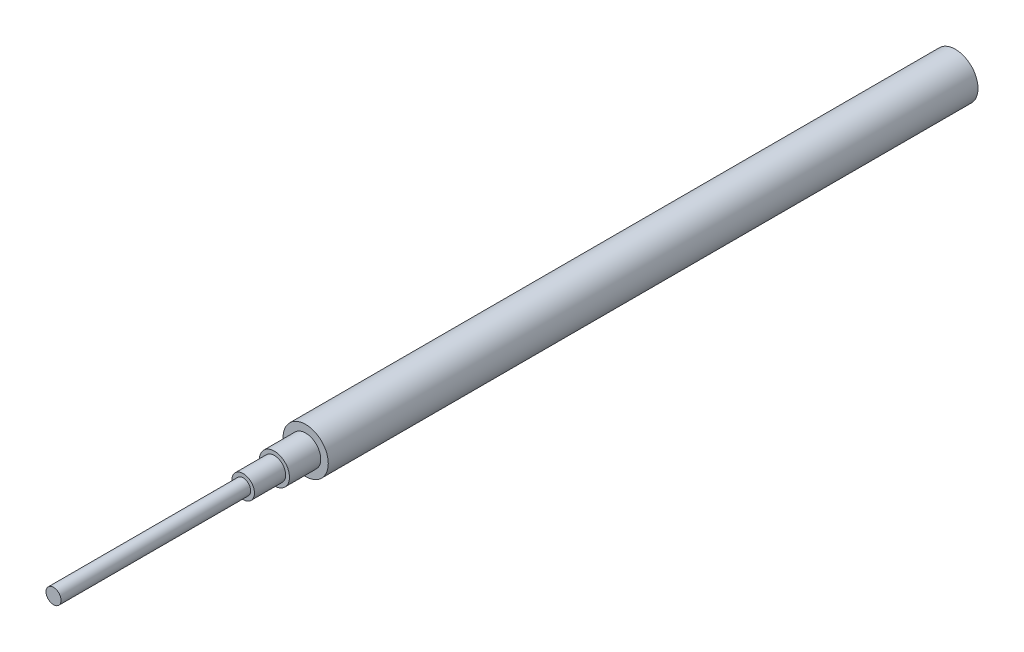
ISO-10303-21;
HEADER;
FILE_DESCRIPTION(('STEP AP214'),'2;1');
FILE_NAME('part.step','',(''),(''),'','','');
FILE_SCHEMA(('AUTOMOTIVE_DESIGN { 1 0 10303 214 1 1 1 1 }'));
ENDSEC;
DATA;
#1=APPLICATION_CONTEXT('core data for automotive mechanical design processes');
#2=APPLICATION_PROTOCOL_DEFINITION('international standard','automotive_design',2000,#1);
#3=PRODUCT_CONTEXT('',#1,'mechanical');
#4=PRODUCT('Part','Part','',(#3));
#5=PRODUCT_RELATED_PRODUCT_CATEGORY('part','',(#4));
#6=PRODUCT_DEFINITION_FORMATION('','',#4);
#7=PRODUCT_DEFINITION_CONTEXT('part definition',#1,'design');
#8=PRODUCT_DEFINITION('design','',#6,#7);
#9=PRODUCT_DEFINITION_SHAPE('','',#8);
#10=(LENGTH_UNIT() NAMED_UNIT(*) SI_UNIT(.MILLI.,.METRE.));
#11=(NAMED_UNIT(*) PLANE_ANGLE_UNIT() SI_UNIT($,.RADIAN.));
#12=(NAMED_UNIT(*) SI_UNIT($,.STERADIAN.) SOLID_ANGLE_UNIT());
#13=UNCERTAINTY_MEASURE_WITH_UNIT(LENGTH_MEASURE(1.E-05),#10,'distance_accuracy_value','');
#14=(GEOMETRIC_REPRESENTATION_CONTEXT(3) GLOBAL_UNCERTAINTY_ASSIGNED_CONTEXT((#13)) GLOBAL_UNIT_ASSIGNED_CONTEXT((#10,
#11,#12)) REPRESENTATION_CONTEXT('',''));
#15=CARTESIAN_POINT('',(0.,0.,0.));
#16=DIRECTION('',(0.,0.,1.));
#17=DIRECTION('',(1.,0.,0.));
#18=AXIS2_PLACEMENT_3D('',#15,#16,#17);
#19=CARTESIAN_POINT('',(0.,0.,136.88));
#20=DIRECTION('',(0.,0.,-1.));
#21=DIRECTION('',(-1.,0.,0.));
#22=AXIS2_PLACEMENT_3D('',#19,#20,#21);
#23=CYLINDRICAL_SURFACE('',#22,4.7625);
#24=CARTESIAN_POINT('',(0.,0.,136.88));
#25=DIRECTION('',(0.,0.,1.));
#26=DIRECTION('',(1.,0.,0.));
#27=AXIS2_PLACEMENT_3D('',#24,#25,#26);
#28=CIRCLE('',#27,4.7625);
#29=CARTESIAN_POINT('',(4.7625,0.,136.88));
#30=VERTEX_POINT('',#29);
#31=EDGE_CURVE('E10',#30,#30,#28,.T.);
#32=ORIENTED_EDGE('',*,*,#31,.F.);
#33=EDGE_LOOP('',(#32));
#34=FACE_BOUND('',#33,.T.);
#35=CARTESIAN_POINT('',(0.,0.,0.));
#36=DIRECTION('',(0.,0.,1.));
#37=DIRECTION('',(1.,0.,0.));
#38=AXIS2_PLACEMENT_3D('',#35,#36,#37);
#39=CIRCLE('',#38,4.7625);
#40=CARTESIAN_POINT('',(4.7625,0.,0.));
#41=VERTEX_POINT('',#40);
#42=EDGE_CURVE('E46',#41,#41,#39,.T.);
#43=ORIENTED_EDGE('',*,*,#42,.T.);
#44=EDGE_LOOP('',(#43));
#45=FACE_BOUND('',#44,.T.);
#46=ADVANCED_FACE('F39',(#34,#45),#23,.T.);
#47=CARTESIAN_POINT('',(0.,0.,136.88));
#48=DIRECTION('',(0.,0.,1.));
#49=DIRECTION('',(1.,0.,0.));
#50=AXIS2_PLACEMENT_3D('',#47,#48,#49);
#51=PLANE('',#50);
#52=CARTESIAN_POINT('',(0.,0.,136.88));
#53=DIRECTION('',(0.,0.,1.));
#54=DIRECTION('',(1.,0.,0.));
#55=AXIS2_PLACEMENT_3D('',#52,#53,#54);
#56=CIRCLE('',#55,3.175);
#57=CARTESIAN_POINT('',(3.175,0.,136.88));
#58=VERTEX_POINT('',#57);
#59=EDGE_CURVE('E51',#58,#58,#56,.F.);
#60=ORIENTED_EDGE('',*,*,#59,.T.);
#61=EDGE_LOOP('',(#60));
#62=FACE_BOUND('',#61,.T.);
#63=ORIENTED_EDGE('',*,*,#31,.T.);
#64=EDGE_LOOP('',(#63));
#65=FACE_BOUND('',#64,.T.);
#66=ADVANCED_FACE('F90',(#62,#65),#51,.T.);
#67=CARTESIAN_POINT('',(0.,0.,0.));
#68=DIRECTION('',(0.,0.,1.));
#69=DIRECTION('',(1.,0.,0.));
#70=AXIS2_PLACEMENT_3D('',#67,#68,#69);
#71=PLANE('',#70);
#72=ORIENTED_EDGE('',*,*,#42,.F.);
#73=EDGE_LOOP('',(#72));
#74=FACE_BOUND('',#73,.T.);
#75=ADVANCED_FACE('F94',(#74),#71,.F.);
#76=CARTESIAN_POINT('',(0.,0.,143.47));
#77=DIRECTION('',(0.,0.,-1.));
#78=DIRECTION('',(-1.,0.,0.));
#79=AXIS2_PLACEMENT_3D('',#76,#77,#78);
#80=CYLINDRICAL_SURFACE('',#79,3.175);
#81=ORIENTED_EDGE('',*,*,#59,.F.);
#82=EDGE_LOOP('',(#81));
#83=FACE_BOUND('',#82,.T.);
#84=CARTESIAN_POINT('',(0.,0.,143.47));
#85=DIRECTION('',(0.,0.,1.));
#86=DIRECTION('',(1.,0.,0.));
#87=AXIS2_PLACEMENT_3D('',#84,#85,#86);
#88=CIRCLE('',#87,3.175);
#89=CARTESIAN_POINT('',(3.175,0.,143.47));
#90=VERTEX_POINT('',#89);
#91=EDGE_CURVE('E60',#90,#90,#88,.T.);
#92=ORIENTED_EDGE('',*,*,#91,.F.);
#93=EDGE_LOOP('',(#92));
#94=FACE_BOUND('',#93,.T.);
#95=ADVANCED_FACE('F101',(#83,#94),#80,.T.);
#96=CARTESIAN_POINT('',(0.,0.,143.47));
#97=DIRECTION('',(0.,0.,1.));
#98=DIRECTION('',(1.,0.,0.));
#99=AXIS2_PLACEMENT_3D('',#96,#97,#98);
#100=PLANE('',#99);
#101=CARTESIAN_POINT('',(0.,0.,143.47));
#102=DIRECTION('',(0.,0.,1.));
#103=DIRECTION('',(1.,0.,0.));
#104=AXIS2_PLACEMENT_3D('',#101,#102,#103);
#105=CIRCLE('',#104,2.38125);
#106=CARTESIAN_POINT('',(2.38125,0.,143.47));
#107=VERTEX_POINT('',#106);
#108=EDGE_CURVE('E54',#107,#107,#105,.F.);
#109=ORIENTED_EDGE('',*,*,#108,.T.);
#110=EDGE_LOOP('',(#109));
#111=FACE_BOUND('',#110,.T.);
#112=ORIENTED_EDGE('',*,*,#91,.T.);
#113=EDGE_LOOP('',(#112));
#114=FACE_BOUND('',#113,.T.);
#115=ADVANCED_FACE('F106',(#111,#114),#100,.T.);
#116=CARTESIAN_POINT('',(0.,0.,150.05));
#117=DIRECTION('',(0.,0.,-1.));
#118=DIRECTION('',(-1.,0.,0.));
#119=AXIS2_PLACEMENT_3D('',#116,#117,#118);
#120=CYLINDRICAL_SURFACE('',#119,2.38125);
#121=ORIENTED_EDGE('',*,*,#108,.F.);
#122=EDGE_LOOP('',(#121));
#123=FACE_BOUND('',#122,.T.);
#124=CARTESIAN_POINT('',(0.,0.,150.05));
#125=DIRECTION('',(0.,0.,1.));
#126=DIRECTION('',(1.,0.,0.));
#127=AXIS2_PLACEMENT_3D('',#124,#125,#126);
#128=CIRCLE('',#127,2.38125);
#129=CARTESIAN_POINT('',(2.38125,0.,150.05));
#130=VERTEX_POINT('',#129);
#131=EDGE_CURVE('E59',#130,#130,#128,.T.);
#132=ORIENTED_EDGE('',*,*,#131,.F.);
#133=EDGE_LOOP('',(#132));
#134=FACE_BOUND('',#133,.T.);
#135=ADVANCED_FACE('F81',(#123,#134),#120,.T.);
#136=CARTESIAN_POINT('',(0.,0.,150.05));
#137=DIRECTION('',(0.,0.,1.));
#138=DIRECTION('',(1.,0.,0.));
#139=AXIS2_PLACEMENT_3D('',#136,#137,#138);
#140=PLANE('',#139);
#141=CARTESIAN_POINT('',(0.,0.,150.05));
#142=DIRECTION('',(0.,0.,1.));
#143=DIRECTION('',(1.,0.,0.));
#144=AXIS2_PLACEMENT_3D('',#141,#142,#143);
#145=CIRCLE('',#144,1.5875);
#146=CARTESIAN_POINT('',(1.5875,0.,150.05));
#147=VERTEX_POINT('',#146);
#148=EDGE_CURVE('E45',#147,#147,#145,.F.);
#149=ORIENTED_EDGE('',*,*,#148,.T.);
#150=EDGE_LOOP('',(#149));
#151=FACE_BOUND('',#150,.T.);
#152=ORIENTED_EDGE('',*,*,#131,.T.);
#153=EDGE_LOOP('',(#152));
#154=FACE_BOUND('',#153,.T.);
#155=ADVANCED_FACE('F76',(#151,#154),#140,.T.);
#156=CARTESIAN_POINT('',(0.,0.,190.));
#157=DIRECTION('',(0.,0.,-1.));
#158=DIRECTION('',(-1.,0.,0.));
#159=AXIS2_PLACEMENT_3D('',#156,#157,#158);
#160=CYLINDRICAL_SURFACE('',#159,1.5875);
#161=ORIENTED_EDGE('',*,*,#148,.F.);
#162=EDGE_LOOP('',(#161));
#163=FACE_BOUND('',#162,.T.);
#164=CARTESIAN_POINT('',(0.,0.,190.));
#165=DIRECTION('',(0.,0.,1.));
#166=DIRECTION('',(1.,0.,0.));
#167=AXIS2_PLACEMENT_3D('',#164,#165,#166);
#168=CIRCLE('',#167,1.5875);
#169=CARTESIAN_POINT('',(1.5875,0.,190.));
#170=VERTEX_POINT('',#169);
#171=EDGE_CURVE('E70',#170,#170,#168,.T.);
#172=ORIENTED_EDGE('',*,*,#171,.F.);
#173=EDGE_LOOP('',(#172));
#174=FACE_BOUND('',#173,.T.);
#175=ADVANCED_FACE('F74',(#163,#174),#160,.T.);
#176=CARTESIAN_POINT('',(0.,0.,190.));
#177=DIRECTION('',(0.,0.,1.));
#178=DIRECTION('',(1.,0.,0.));
#179=AXIS2_PLACEMENT_3D('',#176,#177,#178);
#180=PLANE('',#179);
#181=ORIENTED_EDGE('',*,*,#171,.T.);
#182=EDGE_LOOP('',(#181));
#183=FACE_BOUND('',#182,.T.);
#184=ADVANCED_FACE('F75',(#183),#180,.T.);
#185=CLOSED_SHELL('',(#46,#66,#75,#95,#115,#135,#155,#175,#184));
#186=MANIFOLD_SOLID_BREP('B2',#185);
#187=ADVANCED_BREP_SHAPE_REPRESENTATION('',(#18,#186),#14);
#188=SHAPE_DEFINITION_REPRESENTATION(#9,#187);
ENDSEC;
END-ISO-10303-21;
